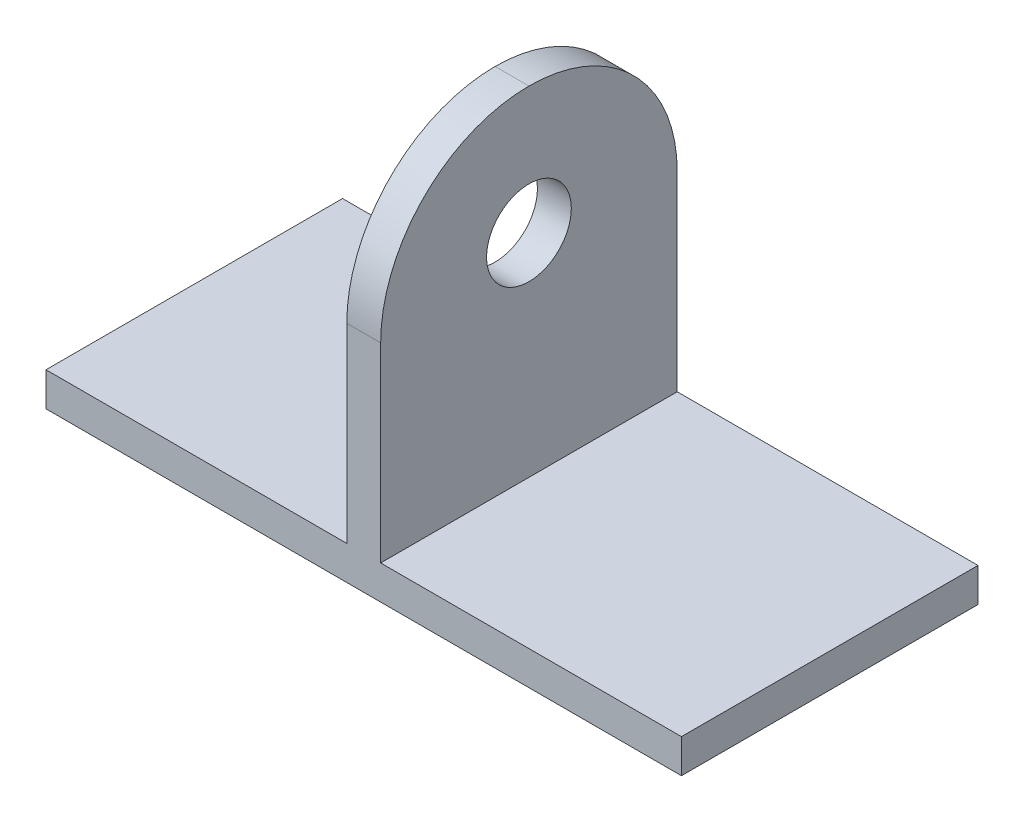
ISO-10303-21;
HEADER;
FILE_DESCRIPTION(('STEP AP214'),'2;1');
FILE_NAME('part.step','',(''),(''),'','','');
FILE_SCHEMA(('AUTOMOTIVE_DESIGN { 1 0 10303 214 1 1 1 1 }'));
ENDSEC;
DATA;
#1=APPLICATION_CONTEXT('core data for automotive mechanical design processes');
#2=APPLICATION_PROTOCOL_DEFINITION('international standard','automotive_design',2000,#1);
#3=PRODUCT_CONTEXT('',#1,'mechanical');
#4=PRODUCT('Part','Part','',(#3));
#5=PRODUCT_RELATED_PRODUCT_CATEGORY('part','',(#4));
#6=PRODUCT_DEFINITION_FORMATION('','',#4);
#7=PRODUCT_DEFINITION_CONTEXT('part definition',#1,'design');
#8=PRODUCT_DEFINITION('design','',#6,#7);
#9=PRODUCT_DEFINITION_SHAPE('','',#8);
#10=(LENGTH_UNIT() NAMED_UNIT(*) SI_UNIT(.MILLI.,.METRE.));
#11=(NAMED_UNIT(*) PLANE_ANGLE_UNIT() SI_UNIT($,.RADIAN.));
#12=(NAMED_UNIT(*) SI_UNIT($,.STERADIAN.) SOLID_ANGLE_UNIT());
#13=UNCERTAINTY_MEASURE_WITH_UNIT(LENGTH_MEASURE(1.E-05),#10,'distance_accuracy_value','');
#14=(GEOMETRIC_REPRESENTATION_CONTEXT(3) GLOBAL_UNCERTAINTY_ASSIGNED_CONTEXT((#13)) GLOBAL_UNIT_ASSIGNED_CONTEXT((#10,
#11,#12)) REPRESENTATION_CONTEXT('',''));
#15=CARTESIAN_POINT('',(0.,0.,0.));
#16=DIRECTION('',(0.,0.,1.));
#17=DIRECTION('',(1.,0.,0.));
#18=AXIS2_PLACEMENT_3D('',#15,#16,#17);
#19=CARTESIAN_POINT('',(0.,4.,0.));
#20=DIRECTION('',(0.,1.,0.));
#21=DIRECTION('',(0.,0.,1.));
#22=AXIS2_PLACEMENT_3D('',#19,#20,#21);
#23=PLANE('',#22);
#24=DIRECTION('',(0.,0.,1.));
#25=VECTOR('',#24,1.);
#26=CARTESIAN_POINT('',(-2.,4.,17.5));
#27=LINE('',#26,#25);
#28=CARTESIAN_POINT('',(-2.,4.,-17.5));
#29=VERTEX_POINT('',#28);
#30=CARTESIAN_POINT('',(-2.,4.,17.5));
#31=VERTEX_POINT('',#30);
#32=EDGE_CURVE('E125',#29,#31,#27,.T.);
#33=ORIENTED_EDGE('',*,*,#32,.F.);
#34=DIRECTION('',(-1.,0.,0.));
#35=VECTOR('',#34,1.);
#36=CARTESIAN_POINT('',(37.5,4.,-17.5));
#37=LINE('',#36,#35);
#38=CARTESIAN_POINT('',(-37.5,4.,-17.5));
#39=VERTEX_POINT('',#38);
#40=EDGE_CURVE('E122',#29,#39,#37,.T.);
#41=ORIENTED_EDGE('',*,*,#40,.T.);
#42=DIRECTION('',(0.,0.,1.));
#43=VECTOR('',#42,1.);
#44=CARTESIAN_POINT('',(-37.5,4.,17.5));
#45=LINE('',#44,#43);
#46=CARTESIAN_POINT('',(-37.5,4.,17.5));
#47=VERTEX_POINT('',#46);
#48=EDGE_CURVE('E137',#39,#47,#45,.T.);
#49=ORIENTED_EDGE('',*,*,#48,.T.);
#50=DIRECTION('',(1.,0.,0.));
#51=VECTOR('',#50,1.);
#52=CARTESIAN_POINT('',(37.5,4.,17.5));
#53=LINE('',#52,#51);
#54=EDGE_CURVE('E142',#47,#31,#53,.T.);
#55=ORIENTED_EDGE('',*,*,#54,.T.);
#56=EDGE_LOOP('',(#33,#41,#49,#55));
#57=FACE_BOUND('',#56,.T.);
#58=ADVANCED_FACE('F33',(#57),#23,.T.);
#59=CARTESIAN_POINT('',(-37.5,4.,17.5));
#60=DIRECTION('',(1.,0.,0.));
#61=DIRECTION('',(0.,0.,-1.));
#62=AXIS2_PLACEMENT_3D('',#59,#60,#61);
#63=PLANE('',#62);
#64=DIRECTION('',(0.,0.,1.));
#65=VECTOR('',#64,1.);
#66=CARTESIAN_POINT('',(-37.5,0.,17.5));
#67=LINE('',#66,#65);
#68=CARTESIAN_POINT('',(-37.5,0.,-17.5));
#69=VERTEX_POINT('',#68);
#70=CARTESIAN_POINT('',(-37.5,0.,17.5));
#71=VERTEX_POINT('',#70);
#72=EDGE_CURVE('E136',#69,#71,#67,.T.);
#73=ORIENTED_EDGE('',*,*,#72,.T.);
#74=DIRECTION('',(0.,-1.,0.));
#75=VECTOR('',#74,1.);
#76=CARTESIAN_POINT('',(-37.5,4.,17.5));
#77=LINE('',#76,#75);
#78=EDGE_CURVE('E160',#47,#71,#77,.T.);
#79=ORIENTED_EDGE('',*,*,#78,.F.);
#80=ORIENTED_EDGE('',*,*,#48,.F.);
#81=DIRECTION('',(0.,-1.,0.));
#82=VECTOR('',#81,1.);
#83=CARTESIAN_POINT('',(-37.5,4.,-17.5));
#84=LINE('',#83,#82);
#85=EDGE_CURVE('E121',#39,#69,#84,.T.);
#86=ORIENTED_EDGE('',*,*,#85,.T.);
#87=EDGE_LOOP('',(#73,#79,#80,#86));
#88=FACE_BOUND('',#87,.T.);
#89=ADVANCED_FACE('F201',(#88),#63,.F.);
#90=CARTESIAN_POINT('',(37.5,4.,17.5));
#91=DIRECTION('',(0.,0.,-1.));
#92=DIRECTION('',(-1.,0.,0.));
#93=AXIS2_PLACEMENT_3D('',#90,#91,#92);
#94=PLANE('',#93);
#95=DIRECTION('',(0.,-1.,0.));
#96=VECTOR('',#95,1.);
#97=CARTESIAN_POINT('',(2.,44.,17.5));
#98=LINE('',#97,#96);
#99=CARTESIAN_POINT('',(2.,26.5,17.5));
#100=VERTEX_POINT('',#99);
#101=CARTESIAN_POINT('',(2.,4.,17.5));
#102=VERTEX_POINT('',#101);
#103=EDGE_CURVE('E110',#100,#102,#98,.T.);
#104=ORIENTED_EDGE('',*,*,#103,.F.);
#105=DIRECTION('',(1.,0.,0.));
#106=VECTOR('',#105,1.);
#107=CARTESIAN_POINT('',(-2.,26.5,17.5));
#108=LINE('',#107,#106);
#109=CARTESIAN_POINT('',(-2.,26.5,17.5));
#110=VERTEX_POINT('',#109);
#111=EDGE_CURVE('E11',#100,#110,#108,.F.);
#112=ORIENTED_EDGE('',*,*,#111,.T.);
#113=DIRECTION('',(0.,-1.,0.));
#114=VECTOR('',#113,1.);
#115=CARTESIAN_POINT('',(-2.,44.,17.5));
#116=LINE('',#115,#114);
#117=EDGE_CURVE('E134',#110,#31,#116,.T.);
#118=ORIENTED_EDGE('',*,*,#117,.T.);
#119=ORIENTED_EDGE('',*,*,#54,.F.);
#120=ORIENTED_EDGE('',*,*,#78,.T.);
#121=DIRECTION('',(1.,0.,0.));
#122=VECTOR('',#121,1.);
#123=CARTESIAN_POINT('',(37.5,0.,17.5));
#124=LINE('',#123,#122);
#125=CARTESIAN_POINT('',(37.5,0.,17.5));
#126=VERTEX_POINT('',#125);
#127=EDGE_CURVE('E148',#71,#126,#124,.T.);
#128=ORIENTED_EDGE('',*,*,#127,.T.);
#129=DIRECTION('',(0.,-1.,0.));
#130=VECTOR('',#129,1.);
#131=CARTESIAN_POINT('',(37.5,4.,17.5));
#132=LINE('',#131,#130);
#133=CARTESIAN_POINT('',(37.5,4.,17.5));
#134=VERTEX_POINT('',#133);
#135=EDGE_CURVE('E157',#134,#126,#132,.T.);
#136=ORIENTED_EDGE('',*,*,#135,.F.);
#137=EDGE_CURVE('E140',#102,#134,#53,.T.);
#138=ORIENTED_EDGE('',*,*,#137,.F.);
#139=EDGE_LOOP('',(#104,#112,#118,#119,#120,#128,#136,#138));
#140=FACE_BOUND('',#139,.T.);
#141=ADVANCED_FACE('F207',(#140),#94,.F.);
#142=CARTESIAN_POINT('',(37.5,4.,17.5));
#143=DIRECTION('',(-1.,0.,0.));
#144=DIRECTION('',(0.,0.,1.));
#145=AXIS2_PLACEMENT_3D('',#142,#143,#144);
#146=PLANE('',#145);
#147=DIRECTION('',(0.,0.,-1.));
#148=VECTOR('',#147,1.);
#149=CARTESIAN_POINT('',(37.5,0.,17.5));
#150=LINE('',#149,#148);
#151=CARTESIAN_POINT('',(37.5,0.,-17.5));
#152=VERTEX_POINT('',#151);
#153=EDGE_CURVE('E150',#126,#152,#150,.T.);
#154=ORIENTED_EDGE('',*,*,#153,.T.);
#155=DIRECTION('',(0.,-1.,0.));
#156=VECTOR('',#155,1.);
#157=CARTESIAN_POINT('',(37.5,4.,-17.5));
#158=LINE('',#157,#156);
#159=CARTESIAN_POINT('',(37.5,4.,-17.5));
#160=VERTEX_POINT('',#159);
#161=EDGE_CURVE('E155',#160,#152,#158,.T.);
#162=ORIENTED_EDGE('',*,*,#161,.F.);
#163=DIRECTION('',(0.,0.,-1.));
#164=VECTOR('',#163,1.);
#165=CARTESIAN_POINT('',(37.5,4.,17.5));
#166=LINE('',#165,#164);
#167=EDGE_CURVE('E119',#134,#160,#166,.T.);
#168=ORIENTED_EDGE('',*,*,#167,.F.);
#169=ORIENTED_EDGE('',*,*,#135,.T.);
#170=EDGE_LOOP('',(#154,#162,#168,#169));
#171=FACE_BOUND('',#170,.T.);
#172=ADVANCED_FACE('F219',(#171),#146,.F.);
#173=CARTESIAN_POINT('',(37.5,4.,-17.5));
#174=DIRECTION('',(0.,0.,1.));
#175=DIRECTION('',(1.,0.,0.));
#176=AXIS2_PLACEMENT_3D('',#173,#174,#175);
#177=PLANE('',#176);
#178=DIRECTION('',(0.,-1.,0.));
#179=VECTOR('',#178,1.);
#180=CARTESIAN_POINT('',(-2.,44.,-17.5));
#181=LINE('',#180,#179);
#182=CARTESIAN_POINT('',(-2.,26.5,-17.5));
#183=VERTEX_POINT('',#182);
#184=EDGE_CURVE('E111',#183,#29,#181,.T.);
#185=ORIENTED_EDGE('',*,*,#184,.F.);
#186=DIRECTION('',(-1.,0.,0.));
#187=VECTOR('',#186,1.);
#188=CARTESIAN_POINT('',(2.,26.5,-17.5));
#189=LINE('',#188,#187);
#190=CARTESIAN_POINT('',(2.,26.5,-17.5));
#191=VERTEX_POINT('',#190);
#192=EDGE_CURVE('E108',#183,#191,#189,.F.);
#193=ORIENTED_EDGE('',*,*,#192,.T.);
#194=DIRECTION('',(0.,-1.,0.));
#195=VECTOR('',#194,1.);
#196=CARTESIAN_POINT('',(2.,44.,-17.5));
#197=LINE('',#196,#195);
#198=CARTESIAN_POINT('',(2.,4.,-17.5));
#199=VERTEX_POINT('',#198);
#200=EDGE_CURVE('E101',#191,#199,#197,.T.);
#201=ORIENTED_EDGE('',*,*,#200,.T.);
#202=EDGE_CURVE('E106',#160,#199,#37,.T.);
#203=ORIENTED_EDGE('',*,*,#202,.F.);
#204=ORIENTED_EDGE('',*,*,#161,.T.);
#205=DIRECTION('',(-1.,0.,0.));
#206=VECTOR('',#205,1.);
#207=CARTESIAN_POINT('',(37.5,0.,-17.5));
#208=LINE('',#207,#206);
#209=EDGE_CURVE('E141',#152,#69,#208,.T.);
#210=ORIENTED_EDGE('',*,*,#209,.T.);
#211=ORIENTED_EDGE('',*,*,#85,.F.);
#212=ORIENTED_EDGE('',*,*,#40,.F.);
#213=EDGE_LOOP('',(#185,#193,#201,#203,#204,#210,#211,#212));
#214=FACE_BOUND('',#213,.T.);
#215=ADVANCED_FACE('F104',(#214),#177,.F.);
#216=DIRECTION('',(0.,0.,-1.));
#217=VECTOR('',#216,1.);
#218=CARTESIAN_POINT('',(2.,4.,17.5));
#219=LINE('',#218,#217);
#220=EDGE_CURVE('E116',#102,#199,#219,.T.);
#221=ORIENTED_EDGE('',*,*,#220,.F.);
#222=ORIENTED_EDGE('',*,*,#137,.T.);
#223=ORIENTED_EDGE('',*,*,#167,.T.);
#224=ORIENTED_EDGE('',*,*,#202,.T.);
#225=EDGE_LOOP('',(#221,#222,#223,#224));
#226=FACE_BOUND('',#225,.T.);
#227=ADVANCED_FACE('F115',(#226),#23,.T.);
#228=CARTESIAN_POINT('',(0.,0.,0.));
#229=DIRECTION('',(0.,1.,0.));
#230=DIRECTION('',(0.,0.,1.));
#231=AXIS2_PLACEMENT_3D('',#228,#229,#230);
#232=PLANE('',#231);
#233=ORIENTED_EDGE('',*,*,#72,.F.);
#234=ORIENTED_EDGE('',*,*,#209,.F.);
#235=ORIENTED_EDGE('',*,*,#153,.F.);
#236=ORIENTED_EDGE('',*,*,#127,.F.);
#237=EDGE_LOOP('',(#233,#234,#235,#236));
#238=FACE_BOUND('',#237,.T.);
#239=ADVANCED_FACE('F213',(#238),#232,.F.);
#240=CARTESIAN_POINT('',(-2.,44.,17.5));
#241=DIRECTION('',(1.,0.,0.));
#242=DIRECTION('',(0.,0.,-1.));
#243=AXIS2_PLACEMENT_3D('',#240,#241,#242);
#244=PLANE('',#243);
#245=CARTESIAN_POINT('',(-2.,29.,0.));
#246=DIRECTION('',(1.,0.,0.));
#247=DIRECTION('',(0.,0.,-1.));
#248=AXIS2_PLACEMENT_3D('',#245,#246,#247);
#249=CIRCLE('',#248,5.);
#250=CARTESIAN_POINT('',(-2.,29.,-5.));
#251=VERTEX_POINT('',#250);
#252=EDGE_CURVE('E129',#251,#251,#249,.T.);
#253=ORIENTED_EDGE('',*,*,#252,.T.);
#254=EDGE_LOOP('',(#253));
#255=FACE_BOUND('',#254,.T.);
#256=CARTESIAN_POINT('',(-2.,26.5,0.));
#257=DIRECTION('',(1.,0.,0.));
#258=DIRECTION('',(0.,0.,-1.));
#259=AXIS2_PLACEMENT_3D('',#256,#257,#258);
#260=CIRCLE('',#259,17.5);
#261=CARTESIAN_POINT('',(-2.,44.,0.));
#262=VERTEX_POINT('',#261);
#263=EDGE_CURVE('E163',#110,#262,#260,.F.);
#264=ORIENTED_EDGE('',*,*,#263,.T.);
#265=CARTESIAN_POINT('',(-2.,26.5,0.));
#266=DIRECTION('',(1.,0.,0.));
#267=DIRECTION('',(0.,0.,-1.));
#268=AXIS2_PLACEMENT_3D('',#265,#266,#267);
#269=CIRCLE('',#268,17.5);
#270=EDGE_CURVE('E165',#262,#183,#269,.F.);
#271=ORIENTED_EDGE('',*,*,#270,.T.);
#272=ORIENTED_EDGE('',*,*,#184,.T.);
#273=ORIENTED_EDGE('',*,*,#32,.T.);
#274=ORIENTED_EDGE('',*,*,#117,.F.);
#275=EDGE_LOOP('',(#264,#271,#272,#273,#274));
#276=FACE_BOUND('',#275,.T.);
#277=ADVANCED_FACE('F171',(#255,#276),#244,.F.);
#278=CARTESIAN_POINT('',(2.,44.,17.5));
#279=DIRECTION('',(-1.,0.,0.));
#280=DIRECTION('',(0.,0.,1.));
#281=AXIS2_PLACEMENT_3D('',#278,#279,#280);
#282=PLANE('',#281);
#283=CARTESIAN_POINT('',(2.,29.,0.));
#284=DIRECTION('',(1.,0.,0.));
#285=DIRECTION('',(0.,0.,-1.));
#286=AXIS2_PLACEMENT_3D('',#283,#284,#285);
#287=CIRCLE('',#286,5.);
#288=CARTESIAN_POINT('',(2.,29.,-5.));
#289=VERTEX_POINT('',#288);
#290=EDGE_CURVE('E182',#289,#289,#287,.T.);
#291=ORIENTED_EDGE('',*,*,#290,.F.);
#292=EDGE_LOOP('',(#291));
#293=FACE_BOUND('',#292,.T.);
#294=ORIENTED_EDGE('',*,*,#200,.F.);
#295=CARTESIAN_POINT('',(2.,26.5,0.));
#296=DIRECTION('',(-1.,0.,0.));
#297=DIRECTION('',(0.,0.,1.));
#298=AXIS2_PLACEMENT_3D('',#295,#296,#297);
#299=CIRCLE('',#298,17.5);
#300=CARTESIAN_POINT('',(2.,44.,0.));
#301=VERTEX_POINT('',#300);
#302=EDGE_CURVE('E42',#191,#301,#299,.F.);
#303=ORIENTED_EDGE('',*,*,#302,.T.);
#304=CARTESIAN_POINT('',(2.,26.5,0.));
#305=DIRECTION('',(-1.,0.,0.));
#306=DIRECTION('',(0.,0.,1.));
#307=AXIS2_PLACEMENT_3D('',#304,#305,#306);
#308=CIRCLE('',#307,17.5);
#309=EDGE_CURVE('E49',#301,#100,#308,.F.);
#310=ORIENTED_EDGE('',*,*,#309,.T.);
#311=ORIENTED_EDGE('',*,*,#103,.T.);
#312=ORIENTED_EDGE('',*,*,#220,.T.);
#313=EDGE_LOOP('',(#294,#303,#310,#311,#312));
#314=FACE_BOUND('',#313,.T.);
#315=ADVANCED_FACE('F124',(#293,#314),#282,.F.);
#316=CARTESIAN_POINT('',(-37.5,29.,0.));
#317=DIRECTION('',(1.,0.,0.));
#318=DIRECTION('',(0.,0.,-1.));
#319=AXIS2_PLACEMENT_3D('',#316,#317,#318);
#320=CYLINDRICAL_SURFACE('',#319,5.);
#321=ORIENTED_EDGE('',*,*,#290,.T.);
#322=EDGE_LOOP('',(#321));
#323=FACE_BOUND('',#322,.T.);
#324=ORIENTED_EDGE('',*,*,#252,.F.);
#325=EDGE_LOOP('',(#324));
#326=FACE_BOUND('',#325,.T.);
#327=ADVANCED_FACE('F191',(#323,#326),#320,.F.);
#328=CARTESIAN_POINT('',(0.,26.5,0.));
#329=DIRECTION('',(-1.,0.,0.));
#330=DIRECTION('',(0.,0.,1.));
#331=AXIS2_PLACEMENT_3D('',#328,#329,#330);
#332=CYLINDRICAL_SURFACE('',#331,17.5);
#333=ORIENTED_EDGE('',*,*,#111,.F.);
#334=ORIENTED_EDGE('',*,*,#309,.F.);
#335=DIRECTION('',(1.,0.,0.));
#336=VECTOR('',#335,1.);
#337=CARTESIAN_POINT('',(2.,44.,0.));
#338=LINE('',#337,#336);
#339=EDGE_CURVE('E37',#262,#301,#338,.T.);
#340=ORIENTED_EDGE('',*,*,#339,.F.);
#341=ORIENTED_EDGE('',*,*,#263,.F.);
#342=EDGE_LOOP('',(#333,#334,#340,#341));
#343=FACE_BOUND('',#342,.T.);
#344=ADVANCED_FACE('F35',(#343),#332,.T.);
#345=CARTESIAN_POINT('',(0.,26.5,0.));
#346=DIRECTION('',(1.,0.,0.));
#347=DIRECTION('',(0.,0.,-1.));
#348=AXIS2_PLACEMENT_3D('',#345,#346,#347);
#349=CYLINDRICAL_SURFACE('',#348,17.5);
#350=ORIENTED_EDGE('',*,*,#302,.F.);
#351=ORIENTED_EDGE('',*,*,#192,.F.);
#352=ORIENTED_EDGE('',*,*,#270,.F.);
#353=ORIENTED_EDGE('',*,*,#339,.T.);
#354=EDGE_LOOP('',(#350,#351,#352,#353));
#355=FACE_BOUND('',#354,.T.);
#356=ADVANCED_FACE('F180',(#355),#349,.T.);
#357=CLOSED_SHELL('',(#58,#89,#141,#172,#215,#227,#239,#277,#315,#327,#344,#356));
#358=MANIFOLD_SOLID_BREP('B2',#357);
#359=ADVANCED_BREP_SHAPE_REPRESENTATION('',(#18,#358),#14);
#360=SHAPE_DEFINITION_REPRESENTATION(#9,#359);
ENDSEC;
END-ISO-10303-21;
